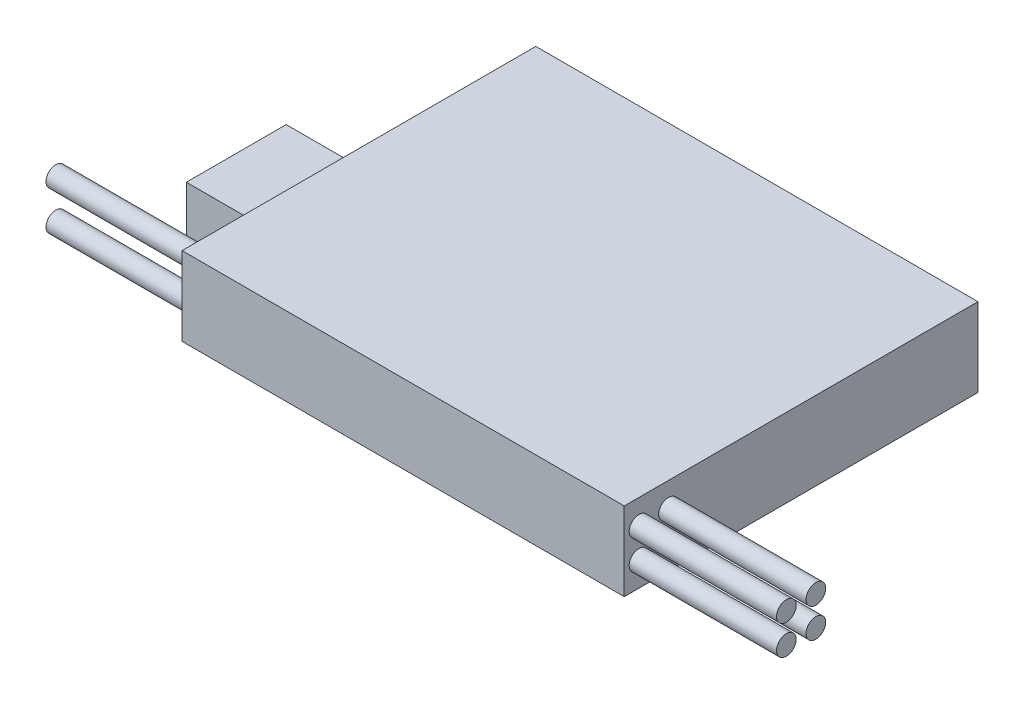
ISO-10303-21;
HEADER;
FILE_DESCRIPTION(('STEP AP214'),'2;1');
FILE_NAME('part.step','',(''),(''),'','','');
FILE_SCHEMA(('AUTOMOTIVE_DESIGN { 1 0 10303 214 1 1 1 1 }'));
ENDSEC;
DATA;
#1=APPLICATION_CONTEXT('core data for automotive mechanical design processes');
#2=APPLICATION_PROTOCOL_DEFINITION('international standard','automotive_design',2000,#1);
#3=PRODUCT_CONTEXT('',#1,'mechanical');
#4=PRODUCT('Part','Part','',(#3));
#5=PRODUCT_RELATED_PRODUCT_CATEGORY('part','',(#4));
#6=PRODUCT_DEFINITION_FORMATION('','',#4);
#7=PRODUCT_DEFINITION_CONTEXT('part definition',#1,'design');
#8=PRODUCT_DEFINITION('design','',#6,#7);
#9=PRODUCT_DEFINITION_SHAPE('','',#8);
#10=(LENGTH_UNIT() NAMED_UNIT(*) SI_UNIT(.MILLI.,.METRE.));
#11=(NAMED_UNIT(*) PLANE_ANGLE_UNIT() SI_UNIT($,.RADIAN.));
#12=(NAMED_UNIT(*) SI_UNIT($,.STERADIAN.) SOLID_ANGLE_UNIT());
#13=UNCERTAINTY_MEASURE_WITH_UNIT(LENGTH_MEASURE(1.E-05),#10,'distance_accuracy_value','');
#14=(GEOMETRIC_REPRESENTATION_CONTEXT(3) GLOBAL_UNCERTAINTY_ASSIGNED_CONTEXT((#13)) GLOBAL_UNIT_ASSIGNED_CONTEXT((#10,
#11,#12)) REPRESENTATION_CONTEXT('',''));
#15=CARTESIAN_POINT('',(0.,0.,0.));
#16=DIRECTION('',(0.,0.,1.));
#17=DIRECTION('',(1.,0.,0.));
#18=AXIS2_PLACEMENT_3D('',#15,#16,#17);
#19=CARTESIAN_POINT('',(-22.5,8.,-18.));
#20=DIRECTION('',(1.,0.,0.));
#21=DIRECTION('',(0.,0.,-1.));
#22=AXIS2_PLACEMENT_3D('',#19,#20,#21);
#23=PLANE('',#22);
#24=CARTESIAN_POINT('',(-22.5,2.,15.8460417429838));
#25=DIRECTION('',(1.,0.,0.));
#26=DIRECTION('',(0.,0.,-1.));
#27=AXIS2_PLACEMENT_3D('',#24,#25,#26);
#28=CIRCLE('',#27,1.);
#29=CARTESIAN_POINT('',(-22.5,2.,14.8460417429838));
#30=VERTEX_POINT('',#29);
#31=EDGE_CURVE('E157',#30,#30,#28,.F.);
#32=ORIENTED_EDGE('',*,*,#31,.F.);
#33=EDGE_LOOP('',(#32));
#34=FACE_BOUND('',#33,.T.);
#35=CARTESIAN_POINT('',(-22.5,6.,15.8460417429838));
#36=DIRECTION('',(1.,0.,0.));
#37=DIRECTION('',(0.,0.,-1.));
#38=AXIS2_PLACEMENT_3D('',#35,#36,#37);
#39=CIRCLE('',#38,1.);
#40=CARTESIAN_POINT('',(-22.5,6.,14.8460417429838));
#41=VERTEX_POINT('',#40);
#42=EDGE_CURVE('E154',#41,#41,#39,.F.);
#43=ORIENTED_EDGE('',*,*,#42,.F.);
#44=EDGE_LOOP('',(#43));
#45=FACE_BOUND('',#44,.T.);
#46=DIRECTION('',(0.,0.,1.));
#47=VECTOR('',#46,1.);
#48=CARTESIAN_POINT('',(-22.5,0.,-18.));
#49=LINE('',#48,#47);
#50=CARTESIAN_POINT('',(-22.5,0.,-18.));
#51=VERTEX_POINT('',#50);
#52=CARTESIAN_POINT('',(-22.5,0.,18.));
#53=VERTEX_POINT('',#52);
#54=EDGE_CURVE('E119',#51,#53,#49,.T.);
#55=ORIENTED_EDGE('',*,*,#54,.T.);
#56=DIRECTION('',(0.,-1.,0.));
#57=VECTOR('',#56,1.);
#58=CARTESIAN_POINT('',(-22.5,8.,18.));
#59=LINE('',#58,#57);
#60=CARTESIAN_POINT('',(-22.5,8.,18.));
#61=VERTEX_POINT('',#60);
#62=EDGE_CURVE('E151',#61,#53,#59,.T.);
#63=ORIENTED_EDGE('',*,*,#62,.F.);
#64=DIRECTION('',(0.,0.,1.));
#65=VECTOR('',#64,1.);
#66=CARTESIAN_POINT('',(-22.5,8.,-18.));
#67=LINE('',#66,#65);
#68=CARTESIAN_POINT('',(-22.5,8.,-18.));
#69=VERTEX_POINT('',#68);
#70=EDGE_CURVE('E128',#69,#61,#67,.T.);
#71=ORIENTED_EDGE('',*,*,#70,.F.);
#72=DIRECTION('',(0.,-1.,0.));
#73=VECTOR('',#72,1.);
#74=CARTESIAN_POINT('',(-22.5,8.,-18.));
#75=LINE('',#74,#73);
#76=EDGE_CURVE('E137',#69,#51,#75,.T.);
#77=ORIENTED_EDGE('',*,*,#76,.T.);
#78=EDGE_LOOP('',(#55,#63,#71,#77));
#79=FACE_BOUND('',#78,.T.);
#80=DIRECTION('',(0.,-1.,0.));
#81=VECTOR('',#80,1.);
#82=CARTESIAN_POINT('',(-22.5,7.81,1.40224176437925));
#83=LINE('',#82,#81);
#84=CARTESIAN_POINT('',(-22.5,7.81,1.40224176437925));
#85=VERTEX_POINT('',#84);
#86=CARTESIAN_POINT('',(-22.5,0.19,1.40224176437926));
#87=VERTEX_POINT('',#86);
#88=EDGE_CURVE('E118',#85,#87,#83,.T.);
#89=ORIENTED_EDGE('',*,*,#88,.F.);
#90=DIRECTION('',(0.,0.,-1.));
#91=VECTOR('',#90,1.);
#92=CARTESIAN_POINT('',(-22.5,7.81,1.40224176437925));
#93=LINE('',#92,#91);
#94=CARTESIAN_POINT('',(-22.5,7.81,11.5622417643793));
#95=VERTEX_POINT('',#94);
#96=EDGE_CURVE('E115',#95,#85,#93,.T.);
#97=ORIENTED_EDGE('',*,*,#96,.F.);
#98=DIRECTION('',(0.,1.,0.));
#99=VECTOR('',#98,1.);
#100=CARTESIAN_POINT('',(-22.5,7.81,11.5622417643793));
#101=LINE('',#100,#99);
#102=CARTESIAN_POINT('',(-22.5,0.19,11.5622417643793));
#103=VERTEX_POINT('',#102);
#104=EDGE_CURVE('E53',#103,#95,#101,.T.);
#105=ORIENTED_EDGE('',*,*,#104,.F.);
#106=DIRECTION('',(0.,0.,1.));
#107=VECTOR('',#106,1.);
#108=CARTESIAN_POINT('',(-22.5,0.19,1.40224176437925));
#109=LINE('',#108,#107);
#110=EDGE_CURVE('E48',#87,#103,#109,.T.);
#111=ORIENTED_EDGE('',*,*,#110,.F.);
#112=EDGE_LOOP('',(#89,#97,#105,#111));
#113=FACE_BOUND('',#112,.T.);
#114=ADVANCED_FACE('F34',(#34,#45,#79,#113),#23,.F.);
#115=CARTESIAN_POINT('',(-22.5,8.,18.));
#116=DIRECTION('',(0.,0.,-1.));
#117=DIRECTION('',(-1.,0.,0.));
#118=AXIS2_PLACEMENT_3D('',#115,#116,#117);
#119=PLANE('',#118);
#120=DIRECTION('',(1.,0.,0.));
#121=VECTOR('',#120,1.);
#122=CARTESIAN_POINT('',(-22.5,0.,18.));
#123=LINE('',#122,#121);
#124=CARTESIAN_POINT('',(22.5,0.,18.));
#125=VERTEX_POINT('',#124);
#126=EDGE_CURVE('E122',#53,#125,#123,.T.);
#127=ORIENTED_EDGE('',*,*,#126,.T.);
#128=DIRECTION('',(0.,-1.,0.));
#129=VECTOR('',#128,1.);
#130=CARTESIAN_POINT('',(22.5,8.,18.));
#131=LINE('',#130,#129);
#132=CARTESIAN_POINT('',(22.5,8.,18.));
#133=VERTEX_POINT('',#132);
#134=EDGE_CURVE('E148',#133,#125,#131,.T.);
#135=ORIENTED_EDGE('',*,*,#134,.F.);
#136=DIRECTION('',(1.,0.,0.));
#137=VECTOR('',#136,1.);
#138=CARTESIAN_POINT('',(-22.5,8.,18.));
#139=LINE('',#138,#137);
#140=EDGE_CURVE('E131',#61,#133,#139,.T.);
#141=ORIENTED_EDGE('',*,*,#140,.F.);
#142=ORIENTED_EDGE('',*,*,#62,.T.);
#143=EDGE_LOOP('',(#127,#135,#141,#142));
#144=FACE_BOUND('',#143,.T.);
#145=ADVANCED_FACE('F174',(#144),#119,.F.);
#146=CARTESIAN_POINT('',(22.5,8.,-18.));
#147=DIRECTION('',(-1.,0.,0.));
#148=DIRECTION('',(0.,0.,1.));
#149=AXIS2_PLACEMENT_3D('',#146,#147,#148);
#150=PLANE('',#149);
#151=CARTESIAN_POINT('',(22.5,5.5,13.5));
#152=DIRECTION('',(-1.,0.,0.));
#153=DIRECTION('',(0.,0.,1.));
#154=AXIS2_PLACEMENT_3D('',#151,#152,#153);
#155=CIRCLE('',#154,1.);
#156=CARTESIAN_POINT('',(22.5,5.5,14.5));
#157=VERTEX_POINT('',#156);
#158=EDGE_CURVE('E11',#157,#157,#155,.F.);
#159=ORIENTED_EDGE('',*,*,#158,.F.);
#160=EDGE_LOOP('',(#159));
#161=FACE_BOUND('',#160,.T.);
#162=CARTESIAN_POINT('',(22.5,2.5,13.5));
#163=DIRECTION('',(-1.,0.,0.));
#164=DIRECTION('',(0.,0.,1.));
#165=AXIS2_PLACEMENT_3D('',#162,#163,#164);
#166=CIRCLE('',#165,1.);
#167=CARTESIAN_POINT('',(22.5,2.5,14.5));
#168=VERTEX_POINT('',#167);
#169=EDGE_CURVE('E41',#168,#168,#166,.F.);
#170=ORIENTED_EDGE('',*,*,#169,.F.);
#171=EDGE_LOOP('',(#170));
#172=FACE_BOUND('',#171,.T.);
#173=CARTESIAN_POINT('',(22.5,2.5,16.5));
#174=DIRECTION('',(-1.,0.,0.));
#175=DIRECTION('',(0.,0.,1.));
#176=AXIS2_PLACEMENT_3D('',#173,#174,#175);
#177=CIRCLE('',#176,1.);
#178=CARTESIAN_POINT('',(22.5,2.5,17.5));
#179=VERTEX_POINT('',#178);
#180=EDGE_CURVE('E163',#179,#179,#177,.F.);
#181=ORIENTED_EDGE('',*,*,#180,.F.);
#182=EDGE_LOOP('',(#181));
#183=FACE_BOUND('',#182,.T.);
#184=CARTESIAN_POINT('',(22.5,5.5,16.5));
#185=DIRECTION('',(-1.,0.,0.));
#186=DIRECTION('',(0.,0.,1.));
#187=AXIS2_PLACEMENT_3D('',#184,#185,#186);
#188=CIRCLE('',#187,1.);
#189=CARTESIAN_POINT('',(22.5,5.5,17.5));
#190=VERTEX_POINT('',#189);
#191=EDGE_CURVE('E160',#190,#190,#188,.F.);
#192=ORIENTED_EDGE('',*,*,#191,.F.);
#193=EDGE_LOOP('',(#192));
#194=FACE_BOUND('',#193,.T.);
#195=DIRECTION('',(0.,0.,-1.));
#196=VECTOR('',#195,1.);
#197=CARTESIAN_POINT('',(22.5,0.,-18.));
#198=LINE('',#197,#196);
#199=CARTESIAN_POINT('',(22.5,0.,-18.));
#200=VERTEX_POINT('',#199);
#201=EDGE_CURVE('E140',#125,#200,#198,.T.);
#202=ORIENTED_EDGE('',*,*,#201,.T.);
#203=DIRECTION('',(0.,-1.,0.));
#204=VECTOR('',#203,1.);
#205=CARTESIAN_POINT('',(22.5,8.,-18.));
#206=LINE('',#205,#204);
#207=CARTESIAN_POINT('',(22.5,8.,-18.));
#208=VERTEX_POINT('',#207);
#209=EDGE_CURVE('E145',#208,#200,#206,.T.);
#210=ORIENTED_EDGE('',*,*,#209,.F.);
#211=DIRECTION('',(0.,0.,-1.));
#212=VECTOR('',#211,1.);
#213=CARTESIAN_POINT('',(22.5,8.,-18.));
#214=LINE('',#213,#212);
#215=EDGE_CURVE('E134',#133,#208,#214,.T.);
#216=ORIENTED_EDGE('',*,*,#215,.F.);
#217=ORIENTED_EDGE('',*,*,#134,.T.);
#218=EDGE_LOOP('',(#202,#210,#216,#217));
#219=FACE_BOUND('',#218,.T.);
#220=ADVANCED_FACE('F170',(#161,#172,#183,#194,#219),#150,.F.);
#221=CARTESIAN_POINT('',(-22.5,8.,-18.));
#222=DIRECTION('',(0.,0.,1.));
#223=DIRECTION('',(1.,0.,0.));
#224=AXIS2_PLACEMENT_3D('',#221,#222,#223);
#225=PLANE('',#224);
#226=DIRECTION('',(-1.,0.,0.));
#227=VECTOR('',#226,1.);
#228=CARTESIAN_POINT('',(-22.5,0.,-18.));
#229=LINE('',#228,#227);
#230=EDGE_CURVE('E132',#200,#51,#229,.T.);
#231=ORIENTED_EDGE('',*,*,#230,.T.);
#232=ORIENTED_EDGE('',*,*,#76,.F.);
#233=DIRECTION('',(-1.,0.,0.));
#234=VECTOR('',#233,1.);
#235=CARTESIAN_POINT('',(-22.5,8.,-18.));
#236=LINE('',#235,#234);
#237=EDGE_CURVE('E136',#208,#69,#236,.T.);
#238=ORIENTED_EDGE('',*,*,#237,.F.);
#239=ORIENTED_EDGE('',*,*,#209,.T.);
#240=EDGE_LOOP('',(#231,#232,#238,#239));
#241=FACE_BOUND('',#240,.T.);
#242=ADVANCED_FACE('F173',(#241),#225,.F.);
#243=CARTESIAN_POINT('',(0.,8.,0.));
#244=DIRECTION('',(0.,1.,0.));
#245=DIRECTION('',(0.,0.,1.));
#246=AXIS2_PLACEMENT_3D('',#243,#244,#245);
#247=PLANE('',#246);
#248=ORIENTED_EDGE('',*,*,#70,.T.);
#249=ORIENTED_EDGE('',*,*,#140,.T.);
#250=ORIENTED_EDGE('',*,*,#215,.T.);
#251=ORIENTED_EDGE('',*,*,#237,.T.);
#252=EDGE_LOOP('',(#248,#249,#250,#251));
#253=FACE_BOUND('',#252,.T.);
#254=ADVANCED_FACE('F196',(#253),#247,.T.);
#255=CARTESIAN_POINT('',(0.,0.,0.));
#256=DIRECTION('',(0.,1.,0.));
#257=DIRECTION('',(0.,0.,1.));
#258=AXIS2_PLACEMENT_3D('',#255,#256,#257);
#259=PLANE('',#258);
#260=ORIENTED_EDGE('',*,*,#54,.F.);
#261=ORIENTED_EDGE('',*,*,#230,.F.);
#262=ORIENTED_EDGE('',*,*,#201,.F.);
#263=ORIENTED_EDGE('',*,*,#126,.F.);
#264=EDGE_LOOP('',(#260,#261,#262,#263));
#265=FACE_BOUND('',#264,.T.);
#266=ADVANCED_FACE('F191',(#265),#259,.F.);
#267=CARTESIAN_POINT('',(-28.5,7.81,1.40224176437925));
#268=DIRECTION('',(0.,0.,1.));
#269=DIRECTION('',(1.,0.,0.));
#270=AXIS2_PLACEMENT_3D('',#267,#268,#269);
#271=PLANE('',#270);
#272=ORIENTED_EDGE('',*,*,#88,.T.);
#273=DIRECTION('',(1.,0.,0.));
#274=VECTOR('',#273,1.);
#275=CARTESIAN_POINT('',(-28.5,0.19,1.40224176437925));
#276=LINE('',#275,#274);
#277=CARTESIAN_POINT('',(-28.5,0.19,1.40224176437925));
#278=VERTEX_POINT('',#277);
#279=EDGE_CURVE('E99',#278,#87,#276,.T.);
#280=ORIENTED_EDGE('',*,*,#279,.F.);
#281=DIRECTION('',(0.,-1.,0.));
#282=VECTOR('',#281,1.);
#283=CARTESIAN_POINT('',(-28.5,7.81,1.40224176437925));
#284=LINE('',#283,#282);
#285=CARTESIAN_POINT('',(-28.5,7.81,1.40224176437925));
#286=VERTEX_POINT('',#285);
#287=EDGE_CURVE('E106',#286,#278,#284,.T.);
#288=ORIENTED_EDGE('',*,*,#287,.F.);
#289=DIRECTION('',(1.,0.,0.));
#290=VECTOR('',#289,1.);
#291=CARTESIAN_POINT('',(-28.5,7.81,1.40224176437925));
#292=LINE('',#291,#290);
#293=EDGE_CURVE('E294',#286,#85,#292,.T.);
#294=ORIENTED_EDGE('',*,*,#293,.T.);
#295=EDGE_LOOP('',(#272,#280,#288,#294));
#296=FACE_BOUND('',#295,.T.);
#297=ADVANCED_FACE('F117',(#296),#271,.F.);
#298=CARTESIAN_POINT('',(-28.5,0.19,1.40224176437925));
#299=DIRECTION('',(0.,1.,0.));
#300=DIRECTION('',(0.,0.,1.));
#301=AXIS2_PLACEMENT_3D('',#298,#299,#300);
#302=PLANE('',#301);
#303=ORIENTED_EDGE('',*,*,#110,.T.);
#304=DIRECTION('',(1.,0.,0.));
#305=VECTOR('',#304,1.);
#306=CARTESIAN_POINT('',(-28.5,0.19,11.5622417643793));
#307=LINE('',#306,#305);
#308=CARTESIAN_POINT('',(-28.5,0.19,11.5622417643793));
#309=VERTEX_POINT('',#308);
#310=EDGE_CURVE('E102',#309,#103,#307,.T.);
#311=ORIENTED_EDGE('',*,*,#310,.F.);
#312=DIRECTION('',(0.,0.,1.));
#313=VECTOR('',#312,1.);
#314=CARTESIAN_POINT('',(-28.5,0.19,1.40224176437925));
#315=LINE('',#314,#313);
#316=EDGE_CURVE('E95',#278,#309,#315,.T.);
#317=ORIENTED_EDGE('',*,*,#316,.F.);
#318=ORIENTED_EDGE('',*,*,#279,.T.);
#319=EDGE_LOOP('',(#303,#311,#317,#318));
#320=FACE_BOUND('',#319,.T.);
#321=ADVANCED_FACE('F97',(#320),#302,.F.);
#322=CARTESIAN_POINT('',(-28.5,7.81,11.5622417643793));
#323=DIRECTION('',(0.,0.,-1.));
#324=DIRECTION('',(-1.,0.,0.));
#325=AXIS2_PLACEMENT_3D('',#322,#323,#324);
#326=PLANE('',#325);
#327=ORIENTED_EDGE('',*,*,#104,.T.);
#328=DIRECTION('',(1.,0.,0.));
#329=VECTOR('',#328,1.);
#330=CARTESIAN_POINT('',(-28.5,7.81,11.5622417643793));
#331=LINE('',#330,#329);
#332=CARTESIAN_POINT('',(-28.5,7.81,11.5622417643793));
#333=VERTEX_POINT('',#332);
#334=EDGE_CURVE('E124',#333,#95,#331,.T.);
#335=ORIENTED_EDGE('',*,*,#334,.F.);
#336=DIRECTION('',(0.,1.,0.));
#337=VECTOR('',#336,1.);
#338=CARTESIAN_POINT('',(-28.5,7.81,11.5622417643793));
#339=LINE('',#338,#337);
#340=EDGE_CURVE('E105',#309,#333,#339,.T.);
#341=ORIENTED_EDGE('',*,*,#340,.F.);
#342=ORIENTED_EDGE('',*,*,#310,.T.);
#343=EDGE_LOOP('',(#327,#335,#341,#342));
#344=FACE_BOUND('',#343,.T.);
#345=ADVANCED_FACE('F214',(#344),#326,.F.);
#346=CARTESIAN_POINT('',(-28.5,7.81,1.40224176437925));
#347=DIRECTION('',(0.,-1.,0.));
#348=DIRECTION('',(0.,0.,-1.));
#349=AXIS2_PLACEMENT_3D('',#346,#347,#348);
#350=PLANE('',#349);
#351=ORIENTED_EDGE('',*,*,#96,.T.);
#352=ORIENTED_EDGE('',*,*,#293,.F.);
#353=DIRECTION('',(0.,0.,-1.));
#354=VECTOR('',#353,1.);
#355=CARTESIAN_POINT('',(-28.5,7.81,1.40224176437925));
#356=LINE('',#355,#354);
#357=EDGE_CURVE('E111',#333,#286,#356,.T.);
#358=ORIENTED_EDGE('',*,*,#357,.F.);
#359=ORIENTED_EDGE('',*,*,#334,.T.);
#360=EDGE_LOOP('',(#351,#352,#358,#359));
#361=FACE_BOUND('',#360,.T.);
#362=ADVANCED_FACE('F217',(#361),#350,.F.);
#363=CARTESIAN_POINT('',(-28.5,0.,0.));
#364=DIRECTION('',(-1.,0.,0.));
#365=DIRECTION('',(0.,0.,1.));
#366=AXIS2_PLACEMENT_3D('',#363,#364,#365);
#367=PLANE('',#366);
#368=ORIENTED_EDGE('',*,*,#287,.T.);
#369=ORIENTED_EDGE('',*,*,#316,.T.);
#370=ORIENTED_EDGE('',*,*,#340,.T.);
#371=ORIENTED_EDGE('',*,*,#357,.T.);
#372=EDGE_LOOP('',(#368,#369,#370,#371));
#373=FACE_BOUND('',#372,.T.);
#374=ADVANCED_FACE('F109',(#373),#367,.T.);
#375=CARTESIAN_POINT('',(-37.5,6.,15.8460417429838));
#376=DIRECTION('',(1.,0.,0.));
#377=DIRECTION('',(0.,0.,-1.));
#378=AXIS2_PLACEMENT_3D('',#375,#376,#377);
#379=CYLINDRICAL_SURFACE('',#378,1.);
#380=CARTESIAN_POINT('',(-37.5,6.,15.8460417429838));
#381=DIRECTION('',(-1.,0.,0.));
#382=DIRECTION('',(0.,0.,1.));
#383=AXIS2_PLACEMENT_3D('',#380,#381,#382);
#384=CIRCLE('',#383,1.);
#385=CARTESIAN_POINT('',(-37.5,6.,16.8460417429838));
#386=VERTEX_POINT('',#385);
#387=EDGE_CURVE('E289',#386,#386,#384,.T.);
#388=ORIENTED_EDGE('',*,*,#387,.F.);
#389=EDGE_LOOP('',(#388));
#390=FACE_BOUND('',#389,.T.);
#391=ORIENTED_EDGE('',*,*,#42,.T.);
#392=EDGE_LOOP('',(#391));
#393=FACE_BOUND('',#392,.T.);
#394=ADVANCED_FACE('F224',(#390,#393),#379,.T.);
#395=CARTESIAN_POINT('',(-37.5,6.,15.8460417429838));
#396=DIRECTION('',(-1.,0.,0.));
#397=DIRECTION('',(0.,0.,1.));
#398=AXIS2_PLACEMENT_3D('',#395,#396,#397);
#399=PLANE('',#398);
#400=ORIENTED_EDGE('',*,*,#387,.T.);
#401=EDGE_LOOP('',(#400));
#402=FACE_BOUND('',#401,.T.);
#403=ADVANCED_FACE('F227',(#402),#399,.T.);
#404=CARTESIAN_POINT('',(-37.5,2.,15.8460417429838));
#405=DIRECTION('',(1.,0.,0.));
#406=DIRECTION('',(0.,0.,-1.));
#407=AXIS2_PLACEMENT_3D('',#404,#405,#406);
#408=CYLINDRICAL_SURFACE('',#407,1.);
#409=CARTESIAN_POINT('',(-37.5,2.,15.8460417429838));
#410=DIRECTION('',(-1.,0.,0.));
#411=DIRECTION('',(0.,0.,-1.));
#412=AXIS2_PLACEMENT_3D('',#409,#410,#411);
#413=CIRCLE('',#412,1.);
#414=CARTESIAN_POINT('',(-37.5,2.,14.8460417429838));
#415=VERTEX_POINT('',#414);
#416=EDGE_CURVE('E286',#415,#415,#413,.T.);
#417=ORIENTED_EDGE('',*,*,#416,.F.);
#418=EDGE_LOOP('',(#417));
#419=FACE_BOUND('',#418,.T.);
#420=ORIENTED_EDGE('',*,*,#31,.T.);
#421=EDGE_LOOP('',(#420));
#422=FACE_BOUND('',#421,.T.);
#423=ADVANCED_FACE('F231',(#419,#422),#408,.T.);
#424=CARTESIAN_POINT('',(-37.5,2.,15.8460417429838));
#425=DIRECTION('',(1.,0.,0.));
#426=DIRECTION('',(0.,0.,-1.));
#427=AXIS2_PLACEMENT_3D('',#424,#425,#426);
#428=PLANE('',#427);
#429=ORIENTED_EDGE('',*,*,#416,.T.);
#430=EDGE_LOOP('',(#429));
#431=FACE_BOUND('',#430,.T.);
#432=ADVANCED_FACE('F235',(#431),#428,.F.);
#433=CARTESIAN_POINT('',(37.5,5.5,16.5));
#434=DIRECTION('',(-1.,0.,0.));
#435=DIRECTION('',(0.,0.,1.));
#436=AXIS2_PLACEMENT_3D('',#433,#434,#435);
#437=CYLINDRICAL_SURFACE('',#436,1.);
#438=CARTESIAN_POINT('',(37.5,5.5,16.5));
#439=DIRECTION('',(1.,0.,0.));
#440=DIRECTION('',(0.,0.,-1.));
#441=AXIS2_PLACEMENT_3D('',#438,#439,#440);
#442=CIRCLE('',#441,1.);
#443=CARTESIAN_POINT('',(37.5,5.5,15.5));
#444=VERTEX_POINT('',#443);
#445=EDGE_CURVE('E283',#444,#444,#442,.T.);
#446=ORIENTED_EDGE('',*,*,#445,.F.);
#447=EDGE_LOOP('',(#446));
#448=FACE_BOUND('',#447,.T.);
#449=ORIENTED_EDGE('',*,*,#191,.T.);
#450=EDGE_LOOP('',(#449));
#451=FACE_BOUND('',#450,.T.);
#452=ADVANCED_FACE('F239',(#448,#451),#437,.T.);
#453=CARTESIAN_POINT('',(37.5,5.5,16.5));
#454=DIRECTION('',(1.,0.,0.));
#455=DIRECTION('',(0.,0.,-1.));
#456=AXIS2_PLACEMENT_3D('',#453,#454,#455);
#457=PLANE('',#456);
#458=ORIENTED_EDGE('',*,*,#445,.T.);
#459=EDGE_LOOP('',(#458));
#460=FACE_BOUND('',#459,.T.);
#461=ADVANCED_FACE('F243',(#460),#457,.T.);
#462=CARTESIAN_POINT('',(37.5,2.5,16.5));
#463=DIRECTION('',(-1.,0.,0.));
#464=DIRECTION('',(0.,0.,1.));
#465=AXIS2_PLACEMENT_3D('',#462,#463,#464);
#466=CYLINDRICAL_SURFACE('',#465,1.);
#467=CARTESIAN_POINT('',(37.5,2.5,16.5));
#468=DIRECTION('',(1.,0.,0.));
#469=DIRECTION('',(0.,0.,1.));
#470=AXIS2_PLACEMENT_3D('',#467,#468,#469);
#471=CIRCLE('',#470,1.);
#472=CARTESIAN_POINT('',(37.5,2.5,17.5));
#473=VERTEX_POINT('',#472);
#474=EDGE_CURVE('E278',#473,#473,#471,.T.);
#475=ORIENTED_EDGE('',*,*,#474,.F.);
#476=EDGE_LOOP('',(#475));
#477=FACE_BOUND('',#476,.T.);
#478=ORIENTED_EDGE('',*,*,#180,.T.);
#479=EDGE_LOOP('',(#478));
#480=FACE_BOUND('',#479,.T.);
#481=ADVANCED_FACE('F247',(#477,#480),#466,.T.);
#482=CARTESIAN_POINT('',(37.5,2.5,16.5));
#483=DIRECTION('',(-1.,0.,0.));
#484=DIRECTION('',(0.,0.,1.));
#485=AXIS2_PLACEMENT_3D('',#482,#483,#484);
#486=PLANE('',#485);
#487=ORIENTED_EDGE('',*,*,#474,.T.);
#488=EDGE_LOOP('',(#487));
#489=FACE_BOUND('',#488,.T.);
#490=ADVANCED_FACE('F251',(#489),#486,.F.);
#491=CARTESIAN_POINT('',(37.5,2.5,13.5));
#492=DIRECTION('',(-1.,0.,0.));
#493=DIRECTION('',(0.,0.,1.));
#494=AXIS2_PLACEMENT_3D('',#491,#492,#493);
#495=CYLINDRICAL_SURFACE('',#494,1.);
#496=CARTESIAN_POINT('',(37.5,2.5,13.5));
#497=DIRECTION('',(1.,0.,0.));
#498=DIRECTION('',(0.,0.,-1.));
#499=AXIS2_PLACEMENT_3D('',#496,#497,#498);
#500=CIRCLE('',#499,1.);
#501=CARTESIAN_POINT('',(37.5,2.5,12.5));
#502=VERTEX_POINT('',#501);
#503=EDGE_CURVE('E275',#502,#502,#500,.T.);
#504=ORIENTED_EDGE('',*,*,#503,.F.);
#505=EDGE_LOOP('',(#504));
#506=FACE_BOUND('',#505,.T.);
#507=ORIENTED_EDGE('',*,*,#169,.T.);
#508=EDGE_LOOP('',(#507));
#509=FACE_BOUND('',#508,.T.);
#510=ADVANCED_FACE('F168',(#506,#509),#495,.T.);
#511=CARTESIAN_POINT('',(37.5,2.5,13.5));
#512=DIRECTION('',(1.,0.,0.));
#513=DIRECTION('',(0.,0.,-1.));
#514=AXIS2_PLACEMENT_3D('',#511,#512,#513);
#515=PLANE('',#514);
#516=ORIENTED_EDGE('',*,*,#503,.T.);
#517=EDGE_LOOP('',(#516));
#518=FACE_BOUND('',#517,.T.);
#519=ADVANCED_FACE('F258',(#518),#515,.T.);
#520=CARTESIAN_POINT('',(37.5,5.5,13.5));
#521=DIRECTION('',(-1.,0.,0.));
#522=DIRECTION('',(0.,0.,1.));
#523=AXIS2_PLACEMENT_3D('',#520,#521,#522);
#524=CYLINDRICAL_SURFACE('',#523,1.);
#525=CARTESIAN_POINT('',(37.5,5.5,13.5));
#526=DIRECTION('',(1.,0.,0.));
#527=DIRECTION('',(0.,0.,1.));
#528=AXIS2_PLACEMENT_3D('',#525,#526,#527);
#529=CIRCLE('',#528,1.);
#530=CARTESIAN_POINT('',(37.5,5.5,14.5));
#531=VERTEX_POINT('',#530);
#532=EDGE_CURVE('E274',#531,#531,#529,.T.);
#533=ORIENTED_EDGE('',*,*,#532,.F.);
#534=EDGE_LOOP('',(#533));
#535=FACE_BOUND('',#534,.T.);
#536=ORIENTED_EDGE('',*,*,#158,.T.);
#537=EDGE_LOOP('',(#536));
#538=FACE_BOUND('',#537,.T.);
#539=ADVANCED_FACE('F262',(#535,#538),#524,.T.);
#540=CARTESIAN_POINT('',(37.5,5.5,13.5));
#541=DIRECTION('',(-1.,0.,0.));
#542=DIRECTION('',(0.,0.,1.));
#543=AXIS2_PLACEMENT_3D('',#540,#541,#542);
#544=PLANE('',#543);
#545=ORIENTED_EDGE('',*,*,#532,.T.);
#546=EDGE_LOOP('',(#545));
#547=FACE_BOUND('',#546,.T.);
#548=ADVANCED_FACE('F266',(#547),#544,.F.);
#549=CLOSED_SHELL('',(#114,#145,#220,#242,#254,#266,#297,#321,#345,#362,#374,#394,#403,#423,
#432,#452,#461,#481,#490,#510,#519,#539,#548));
#550=MANIFOLD_SOLID_BREP('B2',#549);
#551=ADVANCED_BREP_SHAPE_REPRESENTATION('',(#18,#550),#14);
#552=SHAPE_DEFINITION_REPRESENTATION(#9,#551);
ENDSEC;
END-ISO-10303-21;
